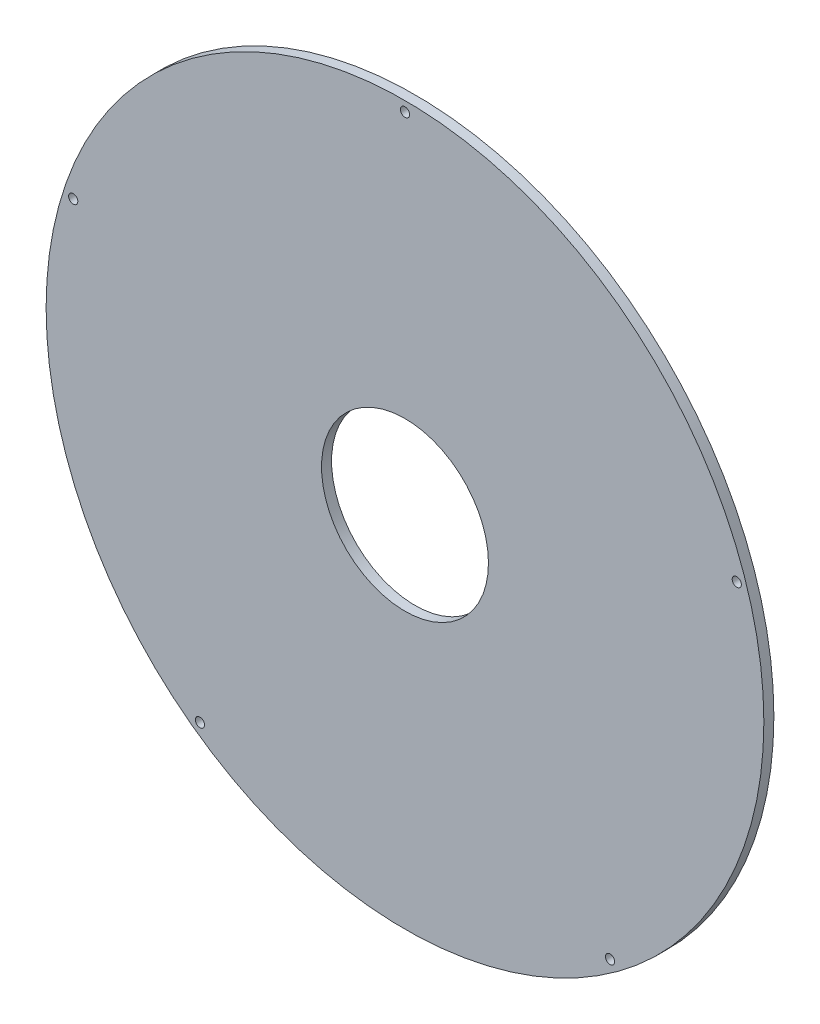
ISO-10303-21;
HEADER;
FILE_DESCRIPTION(('STEP AP214'),'2;1');
FILE_NAME('part.step','',(''),(''),'','','');
FILE_SCHEMA(('AUTOMOTIVE_DESIGN { 1 0 10303 214 1 1 1 1 }'));
ENDSEC;
DATA;
#1=APPLICATION_CONTEXT('core data for automotive mechanical design processes');
#2=APPLICATION_PROTOCOL_DEFINITION('international standard','automotive_design',2000,#1);
#3=PRODUCT_CONTEXT('',#1,'mechanical');
#4=PRODUCT('Part','Part','',(#3));
#5=PRODUCT_RELATED_PRODUCT_CATEGORY('part','',(#4));
#6=PRODUCT_DEFINITION_FORMATION('','',#4);
#7=PRODUCT_DEFINITION_CONTEXT('part definition',#1,'design');
#8=PRODUCT_DEFINITION('design','',#6,#7);
#9=PRODUCT_DEFINITION_SHAPE('','',#8);
#10=(LENGTH_UNIT() NAMED_UNIT(*) SI_UNIT(.MILLI.,.METRE.));
#11=(NAMED_UNIT(*) PLANE_ANGLE_UNIT() SI_UNIT($,.RADIAN.));
#12=(NAMED_UNIT(*) SI_UNIT($,.STERADIAN.) SOLID_ANGLE_UNIT());
#13=UNCERTAINTY_MEASURE_WITH_UNIT(LENGTH_MEASURE(1.E-05),#10,'distance_accuracy_value','');
#14=(GEOMETRIC_REPRESENTATION_CONTEXT(3) GLOBAL_UNCERTAINTY_ASSIGNED_CONTEXT((#13)) GLOBAL_UNIT_ASSIGNED_CONTEXT((#10,
#11,#12)) REPRESENTATION_CONTEXT('',''));
#15=CARTESIAN_POINT('',(0.,0.,0.));
#16=DIRECTION('',(0.,0.,1.));
#17=DIRECTION('',(1.,0.,0.));
#18=AXIS2_PLACEMENT_3D('',#15,#16,#17);
#19=CARTESIAN_POINT('',(0.,0.,6.));
#20=DIRECTION('',(0.,0.,1.));
#21=DIRECTION('',(1.,0.,0.));
#22=AXIS2_PLACEMENT_3D('',#19,#20,#21);
#23=PLANE('',#22);
#24=CARTESIAN_POINT('',(198.770811905687,64.584551824364,6.));
#25=DIRECTION('',(0.,0.,1.));
#26=DIRECTION('',(1.,0.,0.));
#27=AXIS2_PLACEMENT_3D('',#24,#25,#26);
#28=CIRCLE('',#27,2.75);
#29=CARTESIAN_POINT('',(201.520811905687,64.584551824364,6.));
#30=VERTEX_POINT('',#29);
#31=EDGE_CURVE('E53',#30,#30,#28,.T.);
#32=ORIENTED_EDGE('',*,*,#31,.F.);
#33=EDGE_LOOP('',(#32));
#34=FACE_BOUND('',#33,.T.);
#35=CARTESIAN_POINT('',(0.,209.,6.));
#36=DIRECTION('',(0.,0.,1.));
#37=DIRECTION('',(1.,0.,0.));
#38=AXIS2_PLACEMENT_3D('',#35,#36,#37);
#39=CIRCLE('',#38,2.75);
#40=CARTESIAN_POINT('',(2.75000000000001,209.,6.));
#41=VERTEX_POINT('',#40);
#42=EDGE_CURVE('E74',#41,#41,#39,.T.);
#43=ORIENTED_EDGE('',*,*,#42,.F.);
#44=EDGE_LOOP('',(#43));
#45=FACE_BOUND('',#44,.T.);
#46=CARTESIAN_POINT('',(-198.770811905687,64.584551824364,6.));
#47=DIRECTION('',(0.,0.,1.));
#48=DIRECTION('',(1.,0.,0.));
#49=AXIS2_PLACEMENT_3D('',#46,#47,#48);
#50=CIRCLE('',#49,2.75);
#51=CARTESIAN_POINT('',(-196.020811905687,64.584551824364,6.));
#52=VERTEX_POINT('',#51);
#53=EDGE_CURVE('E68',#52,#52,#50,.T.);
#54=ORIENTED_EDGE('',*,*,#53,.F.);
#55=EDGE_LOOP('',(#54));
#56=FACE_BOUND('',#55,.T.);
#57=CARTESIAN_POINT('',(-122.847117729127,-169.084551824364,6.));
#58=DIRECTION('',(0.,0.,1.));
#59=DIRECTION('',(1.,0.,0.));
#60=AXIS2_PLACEMENT_3D('',#57,#58,#59);
#61=CIRCLE('',#60,2.75);
#62=CARTESIAN_POINT('',(-120.097117729127,-169.084551824364,6.));
#63=VERTEX_POINT('',#62);
#64=EDGE_CURVE('E62',#63,#63,#61,.T.);
#65=ORIENTED_EDGE('',*,*,#64,.F.);
#66=EDGE_LOOP('',(#65));
#67=FACE_BOUND('',#66,.T.);
#68=CARTESIAN_POINT('',(122.847117729127,-169.084551824364,6.));
#69=DIRECTION('',(0.,0.,1.));
#70=DIRECTION('',(1.,0.,0.));
#71=AXIS2_PLACEMENT_3D('',#68,#69,#70);
#72=CIRCLE('',#71,2.74999999999999);
#73=CARTESIAN_POINT('',(125.597117729127,-169.084551824364,6.));
#74=VERTEX_POINT('',#73);
#75=EDGE_CURVE('E56',#74,#74,#72,.T.);
#76=ORIENTED_EDGE('',*,*,#75,.F.);
#77=EDGE_LOOP('',(#76));
#78=FACE_BOUND('',#77,.T.);
#79=CARTESIAN_POINT('',(0.,0.,6.));
#80=DIRECTION('',(0.,0.,1.));
#81=DIRECTION('',(1.,0.,0.));
#82=AXIS2_PLACEMENT_3D('',#79,#80,#81);
#83=CIRCLE('',#82,215.);
#84=CARTESIAN_POINT('',(215.,0.,6.));
#85=VERTEX_POINT('',#84);
#86=EDGE_CURVE('E10',#85,#85,#83,.T.);
#87=ORIENTED_EDGE('',*,*,#86,.T.);
#88=EDGE_LOOP('',(#87));
#89=FACE_BOUND('',#88,.T.);
#90=CARTESIAN_POINT('',(0.,0.,6.));
#91=DIRECTION('',(0.,0.,1.));
#92=DIRECTION('',(1.,0.,0.));
#93=AXIS2_PLACEMENT_3D('',#90,#91,#92);
#94=CIRCLE('',#93,50.);
#95=CARTESIAN_POINT('',(50.,0.,6.));
#96=VERTEX_POINT('',#95);
#97=EDGE_CURVE('E48',#96,#96,#94,.T.);
#98=ORIENTED_EDGE('',*,*,#97,.F.);
#99=EDGE_LOOP('',(#98));
#100=FACE_BOUND('',#99,.T.);
#101=ADVANCED_FACE('F37',(#34,#45,#56,#67,#78,#89,#100),#23,.T.);
#102=CARTESIAN_POINT('',(0.,0.,0.));
#103=DIRECTION('',(0.,0.,1.));
#104=DIRECTION('',(1.,0.,0.));
#105=AXIS2_PLACEMENT_3D('',#102,#103,#104);
#106=PLANE('',#105);
#107=CARTESIAN_POINT('',(198.770811905687,64.584551824364,0.));
#108=DIRECTION('',(0.,0.,1.));
#109=DIRECTION('',(1.,0.,0.));
#110=AXIS2_PLACEMENT_3D('',#107,#108,#109);
#111=CIRCLE('',#110,2.75);
#112=CARTESIAN_POINT('',(201.520811905687,64.584551824364,0.));
#113=VERTEX_POINT('',#112);
#114=EDGE_CURVE('E80',#113,#113,#111,.T.);
#115=ORIENTED_EDGE('',*,*,#114,.T.);
#116=EDGE_LOOP('',(#115));
#117=FACE_BOUND('',#116,.T.);
#118=CARTESIAN_POINT('',(0.,209.,0.));
#119=DIRECTION('',(0.,0.,1.));
#120=DIRECTION('',(1.,0.,0.));
#121=AXIS2_PLACEMENT_3D('',#118,#119,#120);
#122=CIRCLE('',#121,2.75);
#123=CARTESIAN_POINT('',(2.75000000000001,209.,0.));
#124=VERTEX_POINT('',#123);
#125=EDGE_CURVE('E77',#124,#124,#122,.T.);
#126=ORIENTED_EDGE('',*,*,#125,.T.);
#127=EDGE_LOOP('',(#126));
#128=FACE_BOUND('',#127,.T.);
#129=CARTESIAN_POINT('',(-198.770811905687,64.584551824364,0.));
#130=DIRECTION('',(0.,0.,1.));
#131=DIRECTION('',(1.,0.,0.));
#132=AXIS2_PLACEMENT_3D('',#129,#130,#131);
#133=CIRCLE('',#132,2.75);
#134=CARTESIAN_POINT('',(-196.020811905687,64.584551824364,0.));
#135=VERTEX_POINT('',#134);
#136=EDGE_CURVE('E71',#135,#135,#133,.T.);
#137=ORIENTED_EDGE('',*,*,#136,.T.);
#138=EDGE_LOOP('',(#137));
#139=FACE_BOUND('',#138,.T.);
#140=CARTESIAN_POINT('',(-122.847117729127,-169.084551824364,0.));
#141=DIRECTION('',(0.,0.,1.));
#142=DIRECTION('',(1.,0.,0.));
#143=AXIS2_PLACEMENT_3D('',#140,#141,#142);
#144=CIRCLE('',#143,2.75);
#145=CARTESIAN_POINT('',(-120.097117729127,-169.084551824364,0.));
#146=VERTEX_POINT('',#145);
#147=EDGE_CURVE('E65',#146,#146,#144,.T.);
#148=ORIENTED_EDGE('',*,*,#147,.T.);
#149=EDGE_LOOP('',(#148));
#150=FACE_BOUND('',#149,.T.);
#151=CARTESIAN_POINT('',(122.847117729127,-169.084551824364,0.));
#152=DIRECTION('',(0.,0.,1.));
#153=DIRECTION('',(1.,0.,0.));
#154=AXIS2_PLACEMENT_3D('',#151,#152,#153);
#155=CIRCLE('',#154,2.74999999999999);
#156=CARTESIAN_POINT('',(125.597117729127,-169.084551824364,0.));
#157=VERTEX_POINT('',#156);
#158=EDGE_CURVE('E59',#157,#157,#155,.T.);
#159=ORIENTED_EDGE('',*,*,#158,.T.);
#160=EDGE_LOOP('',(#159));
#161=FACE_BOUND('',#160,.T.);
#162=CARTESIAN_POINT('',(0.,0.,0.));
#163=DIRECTION('',(0.,0.,1.));
#164=DIRECTION('',(1.,0.,0.));
#165=AXIS2_PLACEMENT_3D('',#162,#163,#164);
#166=CIRCLE('',#165,215.);
#167=CARTESIAN_POINT('',(215.,0.,0.));
#168=VERTEX_POINT('',#167);
#169=EDGE_CURVE('E41',#168,#168,#166,.T.);
#170=ORIENTED_EDGE('',*,*,#169,.F.);
#171=EDGE_LOOP('',(#170));
#172=FACE_BOUND('',#171,.T.);
#173=CARTESIAN_POINT('',(0.,0.,0.));
#174=DIRECTION('',(0.,0.,1.));
#175=DIRECTION('',(1.,0.,0.));
#176=AXIS2_PLACEMENT_3D('',#173,#174,#175);
#177=CIRCLE('',#176,50.);
#178=CARTESIAN_POINT('',(50.,0.,0.));
#179=VERTEX_POINT('',#178);
#180=EDGE_CURVE('E50',#179,#179,#177,.T.);
#181=ORIENTED_EDGE('',*,*,#180,.T.);
#182=EDGE_LOOP('',(#181));
#183=FACE_BOUND('',#182,.T.);
#184=ADVANCED_FACE('F91',(#117,#128,#139,#150,#161,#172,#183),#106,.F.);
#185=CARTESIAN_POINT('',(0.,0.,6.));
#186=DIRECTION('',(0.,0.,-1.));
#187=DIRECTION('',(-1.,0.,0.));
#188=AXIS2_PLACEMENT_3D('',#185,#186,#187);
#189=CYLINDRICAL_SURFACE('',#188,215.);
#190=ORIENTED_EDGE('',*,*,#86,.F.);
#191=EDGE_LOOP('',(#190));
#192=FACE_BOUND('',#191,.T.);
#193=ORIENTED_EDGE('',*,*,#169,.T.);
#194=EDGE_LOOP('',(#193));
#195=FACE_BOUND('',#194,.T.);
#196=ADVANCED_FACE('F39',(#192,#195),#189,.T.);
#197=CARTESIAN_POINT('',(0.,0.,6.));
#198=DIRECTION('',(0.,0.,-1.));
#199=DIRECTION('',(-1.,0.,0.));
#200=AXIS2_PLACEMENT_3D('',#197,#198,#199);
#201=CYLINDRICAL_SURFACE('',#200,50.);
#202=ORIENTED_EDGE('',*,*,#97,.T.);
#203=EDGE_LOOP('',(#202));
#204=FACE_BOUND('',#203,.T.);
#205=ORIENTED_EDGE('',*,*,#180,.F.);
#206=EDGE_LOOP('',(#205));
#207=FACE_BOUND('',#206,.T.);
#208=ADVANCED_FACE('F103',(#204,#207),#201,.F.);
#209=CARTESIAN_POINT('',(122.847117729127,-169.084551824364,6.));
#210=DIRECTION('',(0.,0.,-1.));
#211=DIRECTION('',(-1.,0.,0.));
#212=AXIS2_PLACEMENT_3D('',#209,#210,#211);
#213=CYLINDRICAL_SURFACE('',#212,2.74999999999999);
#214=ORIENTED_EDGE('',*,*,#75,.T.);
#215=EDGE_LOOP('',(#214));
#216=FACE_BOUND('',#215,.T.);
#217=ORIENTED_EDGE('',*,*,#158,.F.);
#218=EDGE_LOOP('',(#217));
#219=FACE_BOUND('',#218,.T.);
#220=ADVANCED_FACE('F106',(#216,#219),#213,.F.);
#221=CARTESIAN_POINT('',(-122.847117729127,-169.084551824364,6.));
#222=DIRECTION('',(0.,0.,-1.));
#223=DIRECTION('',(-1.,0.,0.));
#224=AXIS2_PLACEMENT_3D('',#221,#222,#223);
#225=CYLINDRICAL_SURFACE('',#224,2.75);
#226=ORIENTED_EDGE('',*,*,#64,.T.);
#227=EDGE_LOOP('',(#226));
#228=FACE_BOUND('',#227,.T.);
#229=ORIENTED_EDGE('',*,*,#147,.F.);
#230=EDGE_LOOP('',(#229));
#231=FACE_BOUND('',#230,.T.);
#232=ADVANCED_FACE('F120',(#228,#231),#225,.F.);
#233=CARTESIAN_POINT('',(-198.770811905687,64.584551824364,6.));
#234=DIRECTION('',(0.,0.,-1.));
#235=DIRECTION('',(-1.,0.,0.));
#236=AXIS2_PLACEMENT_3D('',#233,#234,#235);
#237=CYLINDRICAL_SURFACE('',#236,2.75);
#238=ORIENTED_EDGE('',*,*,#53,.T.);
#239=EDGE_LOOP('',(#238));
#240=FACE_BOUND('',#239,.T.);
#241=ORIENTED_EDGE('',*,*,#136,.F.);
#242=EDGE_LOOP('',(#241));
#243=FACE_BOUND('',#242,.T.);
#244=ADVANCED_FACE('F124',(#240,#243),#237,.F.);
#245=CARTESIAN_POINT('',(0.,209.,6.));
#246=DIRECTION('',(0.,0.,-1.));
#247=DIRECTION('',(-1.,0.,0.));
#248=AXIS2_PLACEMENT_3D('',#245,#246,#247);
#249=CYLINDRICAL_SURFACE('',#248,2.75);
#250=ORIENTED_EDGE('',*,*,#42,.T.);
#251=EDGE_LOOP('',(#250));
#252=FACE_BOUND('',#251,.T.);
#253=ORIENTED_EDGE('',*,*,#125,.F.);
#254=EDGE_LOOP('',(#253));
#255=FACE_BOUND('',#254,.T.);
#256=ADVANCED_FACE('F128',(#252,#255),#249,.F.);
#257=CARTESIAN_POINT('',(198.770811905687,64.584551824364,6.));
#258=DIRECTION('',(0.,0.,-1.));
#259=DIRECTION('',(-1.,0.,0.));
#260=AXIS2_PLACEMENT_3D('',#257,#258,#259);
#261=CYLINDRICAL_SURFACE('',#260,2.75);
#262=ORIENTED_EDGE('',*,*,#31,.T.);
#263=EDGE_LOOP('',(#262));
#264=FACE_BOUND('',#263,.T.);
#265=ORIENTED_EDGE('',*,*,#114,.F.);
#266=EDGE_LOOP('',(#265));
#267=FACE_BOUND('',#266,.T.);
#268=ADVANCED_FACE('F86',(#264,#267),#261,.F.);
#269=CLOSED_SHELL('',(#101,#184,#196,#208,#220,#232,#244,#256,#268));
#270=MANIFOLD_SOLID_BREP('B2',#269);
#271=ADVANCED_BREP_SHAPE_REPRESENTATION('',(#18,#270),#14);
#272=SHAPE_DEFINITION_REPRESENTATION(#9,#271);
ENDSEC;
END-ISO-10303-21;
